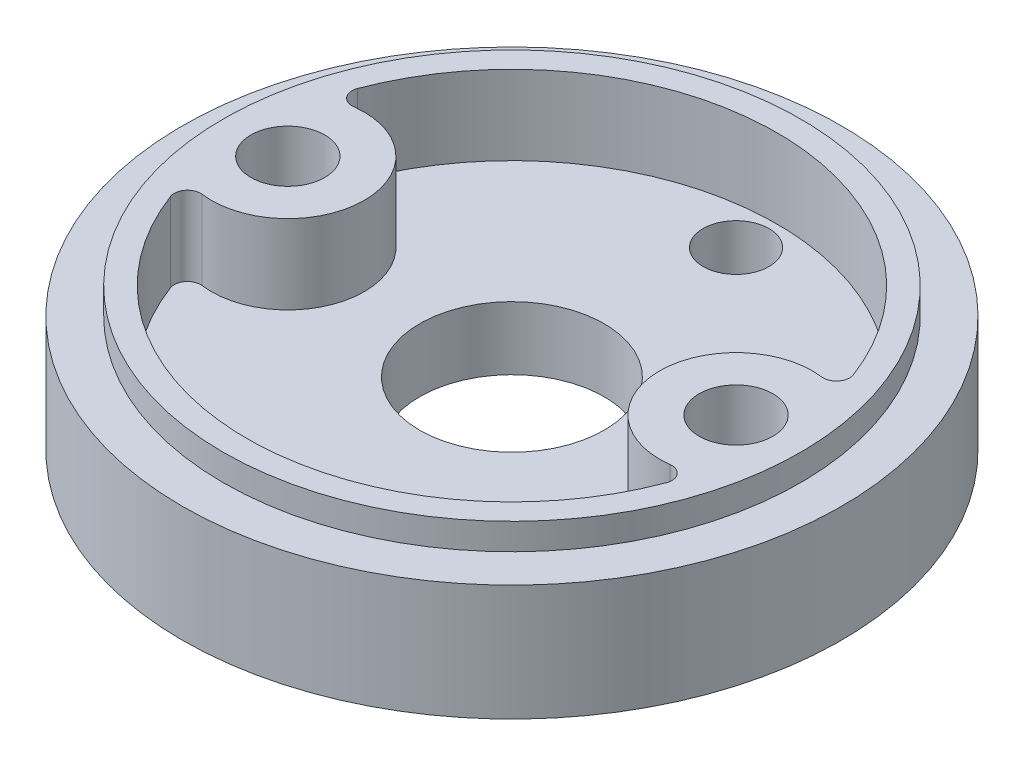
ISO-10303-21;
HEADER;
FILE_DESCRIPTION(('STEP AP214'),'2;1');
FILE_NAME('part.step','',(''),(''),'','','');
FILE_SCHEMA(('AUTOMOTIVE_DESIGN { 1 0 10303 214 1 1 1 1 }'));
ENDSEC;
DATA;
#1=APPLICATION_CONTEXT('core data for automotive mechanical design processes');
#2=APPLICATION_PROTOCOL_DEFINITION('international standard','automotive_design',2000,#1);
#3=PRODUCT_CONTEXT('',#1,'mechanical');
#4=PRODUCT('Part','Part','',(#3));
#5=PRODUCT_RELATED_PRODUCT_CATEGORY('part','',(#4));
#6=PRODUCT_DEFINITION_FORMATION('','',#4);
#7=PRODUCT_DEFINITION_CONTEXT('part definition',#1,'design');
#8=PRODUCT_DEFINITION('design','',#6,#7);
#9=PRODUCT_DEFINITION_SHAPE('','',#8);
#10=(LENGTH_UNIT() NAMED_UNIT(*) SI_UNIT(.MILLI.,.METRE.));
#11=(NAMED_UNIT(*) PLANE_ANGLE_UNIT() SI_UNIT($,.RADIAN.));
#12=(NAMED_UNIT(*) SI_UNIT($,.STERADIAN.) SOLID_ANGLE_UNIT());
#13=UNCERTAINTY_MEASURE_WITH_UNIT(LENGTH_MEASURE(1.E-05),#10,'distance_accuracy_value','');
#14=(GEOMETRIC_REPRESENTATION_CONTEXT(3) GLOBAL_UNCERTAINTY_ASSIGNED_CONTEXT((#13)) GLOBAL_UNIT_ASSIGNED_CONTEXT((#10,
#11,#12)) REPRESENTATION_CONTEXT('',''));
#15=CARTESIAN_POINT('',(0.,0.,0.));
#16=DIRECTION('',(0.,0.,1.));
#17=DIRECTION('',(1.,0.,0.));
#18=AXIS2_PLACEMENT_3D('',#15,#16,#17);
#19=CARTESIAN_POINT('',(8.5,5.4,0.));
#20=DIRECTION('',(0.,-1.,0.));
#21=DIRECTION('',(0.,0.,-1.));
#22=AXIS2_PLACEMENT_3D('',#19,#20,#21);
#23=CYLINDRICAL_SURFACE('',#22,1.4);
#24=CARTESIAN_POINT('',(8.5,5.4,0.));
#25=DIRECTION('',(0.,1.,0.));
#26=DIRECTION('',(0.,0.,1.));
#27=AXIS2_PLACEMENT_3D('',#24,#25,#26);
#28=CIRCLE('',#27,1.4);
#29=CARTESIAN_POINT('',(8.5,5.4,-1.4));
#30=VERTEX_POINT('',#29);
#31=EDGE_CURVE('E162',#30,#30,#28,.T.);
#32=CARTESIAN_POINT('',(8.5,2.65,0.));
#33=DIRECTION('',(0.,-1.,0.));
#34=DIRECTION('',(0.,0.,-1.));
#35=AXIS2_PLACEMENT_3D('',#32,#33,#34);
#36=CIRCLE('',#35,1.4);
#37=CARTESIAN_POINT('',(8.5,2.65,-1.4));
#38=VERTEX_POINT('',#37);
#39=EDGE_CURVE('E40',#38,#38,#36,.F.);
#40=CARTESIAN_POINT('',(8.5,5.4,-1.4));
#41=CARTESIAN_POINT('',(8.5,5.37135416666667,-1.4));
#42=CARTESIAN_POINT('',(8.5,5.34270833333333,-1.4));
#43=CARTESIAN_POINT('',(8.5,5.28541666666667,-1.4));
#44=CARTESIAN_POINT('',(8.5,5.25677083333333,-1.4));
#45=CARTESIAN_POINT('',(8.5,5.19947916666667,-1.4));
#46=CARTESIAN_POINT('',(8.5,5.17083333333333,-1.4));
#47=CARTESIAN_POINT('',(8.5,5.11354166666667,-1.4));
#48=CARTESIAN_POINT('',(8.5,5.08489583333333,-1.4));
#49=CARTESIAN_POINT('',(8.5,5.02760416666667,-1.4));
#50=CARTESIAN_POINT('',(8.5,4.99895833333333,-1.4));
#51=CARTESIAN_POINT('',(8.5,4.94166666666667,-1.4));
#52=CARTESIAN_POINT('',(8.5,4.91302083333333,-1.4));
#53=CARTESIAN_POINT('',(8.5,4.85572916666667,-1.4));
#54=CARTESIAN_POINT('',(8.5,4.82708333333333,-1.4));
#55=CARTESIAN_POINT('',(8.5,4.76979166666667,-1.4));
#56=CARTESIAN_POINT('',(8.5,4.74114583333333,-1.4));
#57=CARTESIAN_POINT('',(8.5,4.68385416666667,-1.4));
#58=CARTESIAN_POINT('',(8.5,4.65520833333333,-1.4));
#59=CARTESIAN_POINT('',(8.5,4.59791666666667,-1.4));
#60=CARTESIAN_POINT('',(8.5,4.56927083333333,-1.4));
#61=CARTESIAN_POINT('',(8.5,4.51197916666667,-1.4));
#62=CARTESIAN_POINT('',(8.5,4.48333333333333,-1.4));
#63=CARTESIAN_POINT('',(8.5,4.42604166666667,-1.4));
#64=CARTESIAN_POINT('',(8.5,4.39739583333333,-1.4));
#65=CARTESIAN_POINT('',(8.5,4.34010416666667,-1.4));
#66=CARTESIAN_POINT('',(8.5,4.31145833333333,-1.4));
#67=CARTESIAN_POINT('',(8.5,4.25416666666667,-1.4));
#68=CARTESIAN_POINT('',(8.5,4.22552083333333,-1.4));
#69=CARTESIAN_POINT('',(8.5,4.16822916666667,-1.4));
#70=CARTESIAN_POINT('',(8.5,4.13958333333333,-1.4));
#71=CARTESIAN_POINT('',(8.5,4.08229166666667,-1.4));
#72=CARTESIAN_POINT('',(8.5,4.05364583333333,-1.4));
#73=CARTESIAN_POINT('',(8.5,3.99635416666667,-1.4));
#74=CARTESIAN_POINT('',(8.5,3.96770833333333,-1.4));
#75=CARTESIAN_POINT('',(8.5,3.91041666666667,-1.4));
#76=CARTESIAN_POINT('',(8.5,3.88177083333333,-1.4));
#77=CARTESIAN_POINT('',(8.5,3.82447916666667,-1.4));
#78=CARTESIAN_POINT('',(8.5,3.79583333333333,-1.4));
#79=CARTESIAN_POINT('',(8.5,3.73854166666667,-1.4));
#80=CARTESIAN_POINT('',(8.5,3.70989583333333,-1.4));
#81=CARTESIAN_POINT('',(8.5,3.65260416666667,-1.4));
#82=CARTESIAN_POINT('',(8.5,3.62395833333333,-1.4));
#83=CARTESIAN_POINT('',(8.5,3.56666666666667,-1.4));
#84=CARTESIAN_POINT('',(8.5,3.53802083333333,-1.4));
#85=CARTESIAN_POINT('',(8.5,3.48072916666667,-1.4));
#86=CARTESIAN_POINT('',(8.5,3.45208333333333,-1.4));
#87=CARTESIAN_POINT('',(8.5,3.39479166666667,-1.4));
#88=CARTESIAN_POINT('',(8.5,3.36614583333333,-1.4));
#89=CARTESIAN_POINT('',(8.5,3.30885416666667,-1.4));
#90=CARTESIAN_POINT('',(8.5,3.28020833333333,-1.4));
#91=CARTESIAN_POINT('',(8.5,3.22291666666667,-1.4));
#92=CARTESIAN_POINT('',(8.5,3.19427083333333,-1.4));
#93=CARTESIAN_POINT('',(8.5,3.13697916666667,-1.4));
#94=CARTESIAN_POINT('',(8.5,3.10833333333333,-1.4));
#95=CARTESIAN_POINT('',(8.5,3.05104166666667,-1.4));
#96=CARTESIAN_POINT('',(8.5,3.02239583333333,-1.4));
#97=CARTESIAN_POINT('',(8.5,2.96510416666667,-1.4));
#98=CARTESIAN_POINT('',(8.5,2.93645833333333,-1.4));
#99=CARTESIAN_POINT('',(8.5,2.87916666666667,-1.4));
#100=CARTESIAN_POINT('',(8.5,2.85052083333333,-1.4));
#101=CARTESIAN_POINT('',(8.5,2.79322916666667,-1.4));
#102=CARTESIAN_POINT('',(8.5,2.76458333333333,-1.4));
#103=CARTESIAN_POINT('',(8.5,2.70729166666667,-1.4));
#104=CARTESIAN_POINT('',(8.5,2.67864583333333,-1.4));
#105=CARTESIAN_POINT('',(8.5,2.65,-1.4));
#106=B_SPLINE_CURVE_WITH_KNOTS('',3,(#40,#41,#42,#43,#44,#45,#46,#47,#48,#49,#50,#51,#52,#53,
#54,#55,#56,#57,#58,#59,#60,#61,#62,#63,#64,#65,#66,#67,#68,#69,#70,#71,#72,#73,#74,#75,#76,#77,
#78,#79,#80,#81,#82,#83,#84,#85,#86,#87,#88,#89,#90,#91,#92,#93,#94,#95,#96,#97,#98,#99,#100,
#101,#102,#103,#104,#105),.UNSPECIFIED.,.F.,.F.,(4,2,2,2,2,2,2,2,2,2,2,2,2,2,2,2,2,2,2,2,2,2,2,
2,2,2,2,2,2,2,2,2,4),(0.,0.0859374999999992,0.171874999999999,0.257812499999999,
0.343749999999999,0.4296875,0.515625,0.6015625,0.6875,0.7734375,0.859375,0.945312499999999,
1.03125,1.1171875,1.203125,1.2890625,1.375,1.4609375,1.546875,1.6328125,1.71875,1.8046875,
1.890625,1.9765625,2.0625,2.1484375,2.234375,2.3203125,2.40625,2.4921875,2.578125,2.6640625,
2.75),.UNSPECIFIED.);
#107=EDGE_CURVE('BSEAM36',#30,#38,#106,.T.);
#108=ORIENTED_EDGE('',*,*,#31,.T.);
#109=ORIENTED_EDGE('',*,*,#39,.F.);
#110=ORIENTED_EDGE('',*,*,#107,.T.);
#111=ORIENTED_EDGE('',*,*,#107,.F.);
#112=EDGE_LOOP('',(#108,#110,#109,#111));
#113=FACE_BOUND('',#112,.T.);
#114=ADVANCED_FACE('F36',(#113),#23,.F.);
#115=CARTESIAN_POINT('',(-8.5,5.4,0.));
#116=DIRECTION('',(0.,-1.,0.));
#117=DIRECTION('',(0.,0.,-1.));
#118=AXIS2_PLACEMENT_3D('',#115,#116,#117);
#119=CYLINDRICAL_SURFACE('',#118,1.4);
#120=CARTESIAN_POINT('',(-8.5,5.4,0.));
#121=DIRECTION('',(0.,1.,0.));
#122=DIRECTION('',(0.,0.,1.));
#123=AXIS2_PLACEMENT_3D('',#120,#121,#122);
#124=CIRCLE('',#123,1.4);
#125=CARTESIAN_POINT('',(-8.5,5.4,-1.4));
#126=VERTEX_POINT('',#125);
#127=EDGE_CURVE('E186',#126,#126,#124,.T.);
#128=CARTESIAN_POINT('',(-8.5,2.65,0.));
#129=DIRECTION('',(0.,-1.,0.));
#130=DIRECTION('',(0.,0.,-1.));
#131=AXIS2_PLACEMENT_3D('',#128,#129,#130);
#132=CIRCLE('',#131,1.4);
#133=CARTESIAN_POINT('',(-8.5,2.65,-1.4));
#134=VERTEX_POINT('',#133);
#135=EDGE_CURVE('E156',#134,#134,#132,.F.);
#136=CARTESIAN_POINT('',(-8.5,5.4,-1.4));
#137=CARTESIAN_POINT('',(-8.5,5.37135416666667,-1.4));
#138=CARTESIAN_POINT('',(-8.5,5.34270833333333,-1.4));
#139=CARTESIAN_POINT('',(-8.5,5.28541666666667,-1.4));
#140=CARTESIAN_POINT('',(-8.5,5.25677083333333,-1.4));
#141=CARTESIAN_POINT('',(-8.5,5.19947916666667,-1.4));
#142=CARTESIAN_POINT('',(-8.5,5.17083333333333,-1.4));
#143=CARTESIAN_POINT('',(-8.5,5.11354166666667,-1.4));
#144=CARTESIAN_POINT('',(-8.5,5.08489583333333,-1.4));
#145=CARTESIAN_POINT('',(-8.5,5.02760416666667,-1.4));
#146=CARTESIAN_POINT('',(-8.5,4.99895833333333,-1.4));
#147=CARTESIAN_POINT('',(-8.5,4.94166666666667,-1.4));
#148=CARTESIAN_POINT('',(-8.5,4.91302083333333,-1.4));
#149=CARTESIAN_POINT('',(-8.5,4.85572916666667,-1.4));
#150=CARTESIAN_POINT('',(-8.5,4.82708333333333,-1.4));
#151=CARTESIAN_POINT('',(-8.5,4.76979166666667,-1.4));
#152=CARTESIAN_POINT('',(-8.5,4.74114583333333,-1.4));
#153=CARTESIAN_POINT('',(-8.5,4.68385416666667,-1.4));
#154=CARTESIAN_POINT('',(-8.5,4.65520833333333,-1.4));
#155=CARTESIAN_POINT('',(-8.5,4.59791666666667,-1.4));
#156=CARTESIAN_POINT('',(-8.5,4.56927083333333,-1.4));
#157=CARTESIAN_POINT('',(-8.5,4.51197916666667,-1.4));
#158=CARTESIAN_POINT('',(-8.5,4.48333333333333,-1.4));
#159=CARTESIAN_POINT('',(-8.5,4.42604166666667,-1.4));
#160=CARTESIAN_POINT('',(-8.5,4.39739583333333,-1.4));
#161=CARTESIAN_POINT('',(-8.5,4.34010416666667,-1.4));
#162=CARTESIAN_POINT('',(-8.5,4.31145833333333,-1.4));
#163=CARTESIAN_POINT('',(-8.5,4.25416666666667,-1.4));
#164=CARTESIAN_POINT('',(-8.5,4.22552083333333,-1.4));
#165=CARTESIAN_POINT('',(-8.5,4.16822916666667,-1.4));
#166=CARTESIAN_POINT('',(-8.5,4.13958333333333,-1.4));
#167=CARTESIAN_POINT('',(-8.5,4.08229166666667,-1.4));
#168=CARTESIAN_POINT('',(-8.5,4.05364583333333,-1.4));
#169=CARTESIAN_POINT('',(-8.5,3.99635416666667,-1.4));
#170=CARTESIAN_POINT('',(-8.5,3.96770833333333,-1.4));
#171=CARTESIAN_POINT('',(-8.5,3.91041666666667,-1.4));
#172=CARTESIAN_POINT('',(-8.5,3.88177083333333,-1.4));
#173=CARTESIAN_POINT('',(-8.5,3.82447916666667,-1.4));
#174=CARTESIAN_POINT('',(-8.5,3.79583333333333,-1.4));
#175=CARTESIAN_POINT('',(-8.5,3.73854166666667,-1.4));
#176=CARTESIAN_POINT('',(-8.5,3.70989583333333,-1.4));
#177=CARTESIAN_POINT('',(-8.5,3.65260416666667,-1.4));
#178=CARTESIAN_POINT('',(-8.5,3.62395833333333,-1.4));
#179=CARTESIAN_POINT('',(-8.5,3.56666666666667,-1.4));
#180=CARTESIAN_POINT('',(-8.5,3.53802083333333,-1.4));
#181=CARTESIAN_POINT('',(-8.5,3.48072916666667,-1.4));
#182=CARTESIAN_POINT('',(-8.5,3.45208333333333,-1.4));
#183=CARTESIAN_POINT('',(-8.5,3.39479166666667,-1.4));
#184=CARTESIAN_POINT('',(-8.5,3.36614583333333,-1.4));
#185=CARTESIAN_POINT('',(-8.5,3.30885416666667,-1.4));
#186=CARTESIAN_POINT('',(-8.5,3.28020833333333,-1.4));
#187=CARTESIAN_POINT('',(-8.5,3.22291666666667,-1.4));
#188=CARTESIAN_POINT('',(-8.5,3.19427083333333,-1.4));
#189=CARTESIAN_POINT('',(-8.5,3.13697916666667,-1.4));
#190=CARTESIAN_POINT('',(-8.5,3.10833333333333,-1.4));
#191=CARTESIAN_POINT('',(-8.5,3.05104166666667,-1.4));
#192=CARTESIAN_POINT('',(-8.5,3.02239583333333,-1.4));
#193=CARTESIAN_POINT('',(-8.5,2.96510416666667,-1.4));
#194=CARTESIAN_POINT('',(-8.5,2.93645833333333,-1.4));
#195=CARTESIAN_POINT('',(-8.5,2.87916666666667,-1.4));
#196=CARTESIAN_POINT('',(-8.5,2.85052083333333,-1.4));
#197=CARTESIAN_POINT('',(-8.5,2.79322916666667,-1.4));
#198=CARTESIAN_POINT('',(-8.5,2.76458333333333,-1.4));
#199=CARTESIAN_POINT('',(-8.5,2.70729166666667,-1.4));
#200=CARTESIAN_POINT('',(-8.5,2.67864583333333,-1.4));
#201=CARTESIAN_POINT('',(-8.5,2.65,-1.4));
#202=B_SPLINE_CURVE_WITH_KNOTS('',3,(#136,#137,#138,#139,#140,#141,#142,#143,#144,#145,#146,
#147,#148,#149,#150,#151,#152,#153,#154,#155,#156,#157,#158,#159,#160,#161,#162,#163,#164,#165,
#166,#167,#168,#169,#170,#171,#172,#173,#174,#175,#176,#177,#178,#179,#180,#181,#182,#183,#184,
#185,#186,#187,#188,#189,#190,#191,#192,#193,#194,#195,#196,#197,#198,#199,#200,#201),
.UNSPECIFIED.,.F.,.F.,(4,2,2,2,2,2,2,2,2,2,2,2,2,2,2,2,2,2,2,2,2,2,2,2,2,2,2,2,2,2,2,2,4),(0.,
0.0859374999999992,0.171874999999999,0.257812499999999,0.343749999999999,0.4296875,0.515625,
0.6015625,0.6875,0.7734375,0.859375,0.945312499999999,1.03125,1.1171875,1.203125,1.2890625,
1.375,1.4609375,1.546875,1.6328125,1.71875,1.8046875,1.890625,1.9765625,2.0625,2.1484375,
2.234375,2.3203125,2.40625,2.4921875,2.578125,2.6640625,2.75),.UNSPECIFIED.);
#203=EDGE_CURVE('BSEAM233',#126,#134,#202,.T.);
#204=ORIENTED_EDGE('',*,*,#127,.T.);
#205=ORIENTED_EDGE('',*,*,#135,.F.);
#206=ORIENTED_EDGE('',*,*,#203,.T.);
#207=ORIENTED_EDGE('',*,*,#203,.F.);
#208=EDGE_LOOP('',(#204,#206,#205,#207));
#209=FACE_BOUND('',#208,.T.);
#210=ADVANCED_FACE('F233',(#209),#119,.F.);
#211=CARTESIAN_POINT('',(0.,2.4,0.));
#212=DIRECTION('',(0.,1.,0.));
#213=DIRECTION('',(0.,0.,1.));
#214=AXIS2_PLACEMENT_3D('',#211,#212,#213);
#215=CYLINDRICAL_SURFACE('',#214,10.05);
#216=CARTESIAN_POINT('',(0.,2.4,0.));
#217=DIRECTION('',(0.,1.,0.));
#218=DIRECTION('',(0.,0.,1.));
#219=AXIS2_PLACEMENT_3D('',#216,#217,#218);
#220=CIRCLE('',#219,10.05);
#221=CARTESIAN_POINT('',(9.40264628888205,2.4,-3.54862547561344));
#222=VERTEX_POINT('',#221);
#223=CARTESIAN_POINT('',(-9.40264628888205,2.4,-3.54862547561344));
#224=VERTEX_POINT('',#223);
#225=EDGE_CURVE('E122',#222,#224,#220,.T.);
#226=ORIENTED_EDGE('',*,*,#225,.F.);
#227=DIRECTION('',(0.,1.,0.));
#228=VECTOR('',#227,1.);
#229=CARTESIAN_POINT('',(9.40264628888205,2.4,-3.54862547561344));
#230=LINE('',#229,#228);
#231=CARTESIAN_POINT('',(9.40264628888205,5.4,-3.54862547561344));
#232=VERTEX_POINT('',#231);
#233=EDGE_CURVE('E147',#222,#232,#230,.T.);
#234=ORIENTED_EDGE('',*,*,#233,.T.);
#235=CARTESIAN_POINT('',(0.,5.4,0.));
#236=DIRECTION('',(0.,1.,0.));
#237=DIRECTION('',(0.,0.,1.));
#238=AXIS2_PLACEMENT_3D('',#235,#236,#237);
#239=CIRCLE('',#238,10.05);
#240=CARTESIAN_POINT('',(-9.40264628888205,5.4,-3.54862547561344));
#241=VERTEX_POINT('',#240);
#242=EDGE_CURVE('E198',#232,#241,#239,.T.);
#243=ORIENTED_EDGE('',*,*,#242,.T.);
#244=DIRECTION('',(0.,1.,0.));
#245=VECTOR('',#244,1.);
#246=CARTESIAN_POINT('',(-9.40264628888205,2.4,-3.54862547561344));
#247=LINE('',#246,#245);
#248=EDGE_CURVE('E144',#241,#224,#247,.F.);
#249=ORIENTED_EDGE('',*,*,#248,.T.);
#250=EDGE_LOOP('',(#226,#234,#243,#249));
#251=FACE_BOUND('',#250,.T.);
#252=ADVANCED_FACE('F239',(#251),#215,.F.);
#253=CARTESIAN_POINT('',(-9.40264628888205,5.4,3.54862547561344));
#254=VERTEX_POINT('',#253);
#255=CARTESIAN_POINT('',(9.40264628888205,5.4,3.54862547561344));
#256=VERTEX_POINT('',#255);
#257=EDGE_CURVE('E202',#254,#256,#239,.T.);
#258=ORIENTED_EDGE('',*,*,#257,.T.);
#259=DIRECTION('',(0.,1.,0.));
#260=VECTOR('',#259,1.);
#261=CARTESIAN_POINT('',(9.40264628888205,2.4,3.54862547561344));
#262=LINE('',#261,#260);
#263=CARTESIAN_POINT('',(9.40264628888205,2.4,3.54862547561344));
#264=VERTEX_POINT('',#263);
#265=EDGE_CURVE('E113',#256,#264,#262,.F.);
#266=ORIENTED_EDGE('',*,*,#265,.T.);
#267=CARTESIAN_POINT('',(-9.40264628888205,2.4,3.54862547561344));
#268=VERTEX_POINT('',#267);
#269=EDGE_CURVE('E106',#268,#264,#220,.T.);
#270=ORIENTED_EDGE('',*,*,#269,.F.);
#271=DIRECTION('',(0.,1.,0.));
#272=VECTOR('',#271,1.);
#273=CARTESIAN_POINT('',(-9.40264628888205,2.4,3.54862547561344));
#274=LINE('',#273,#272);
#275=EDGE_CURVE('E119',#268,#254,#274,.T.);
#276=ORIENTED_EDGE('',*,*,#275,.T.);
#277=EDGE_LOOP('',(#258,#266,#270,#276));
#278=FACE_BOUND('',#277,.T.);
#279=ADVANCED_FACE('F118',(#278),#215,.F.);
#280=CARTESIAN_POINT('',(0.,2.4,0.));
#281=DIRECTION('',(0.,1.,0.));
#282=DIRECTION('',(0.,0.,1.));
#283=AXIS2_PLACEMENT_3D('',#280,#281,#282);
#284=PLANE('',#283);
#285=CARTESIAN_POINT('',(0.,2.4,-8.5));
#286=DIRECTION('',(0.,1.,0.));
#287=DIRECTION('',(0.,0.,1.));
#288=AXIS2_PLACEMENT_3D('',#285,#286,#287);
#289=CIRCLE('',#288,1.25);
#290=CARTESIAN_POINT('',(0.,2.4,-7.25));
#291=VERTEX_POINT('',#290);
#292=EDGE_CURVE('E320',#291,#291,#289,.T.);
#293=ORIENTED_EDGE('',*,*,#292,.F.);
#294=EDGE_LOOP('',(#293));
#295=FACE_BOUND('',#294,.T.);
#296=CARTESIAN_POINT('',(0.,2.4,8.5));
#297=DIRECTION('',(0.,1.,0.));
#298=DIRECTION('',(0.,0.,1.));
#299=AXIS2_PLACEMENT_3D('',#296,#297,#298);
#300=CIRCLE('',#299,1.25);
#301=CARTESIAN_POINT('',(0.,2.4,9.75));
#302=VERTEX_POINT('',#301);
#303=EDGE_CURVE('E172',#302,#302,#300,.T.);
#304=ORIENTED_EDGE('',*,*,#303,.F.);
#305=EDGE_LOOP('',(#304));
#306=FACE_BOUND('',#305,.T.);
#307=CARTESIAN_POINT('',(0.,2.4,0.));
#308=DIRECTION('',(0.,1.,0.));
#309=DIRECTION('',(0.,0.,1.));
#310=AXIS2_PLACEMENT_3D('',#307,#308,#309);
#311=CIRCLE('',#310,3.5);
#312=CARTESIAN_POINT('',(0.,2.4,3.5));
#313=VERTEX_POINT('',#312);
#314=EDGE_CURVE('E192',#313,#313,#311,.T.);
#315=ORIENTED_EDGE('',*,*,#314,.F.);
#316=EDGE_LOOP('',(#315));
#317=FACE_BOUND('',#316,.T.);
#318=ORIENTED_EDGE('',*,*,#269,.T.);
#319=CARTESIAN_POINT('',(8.93485294117647,2.4,3.37207694448839));
#320=DIRECTION('',(0.,1.,0.));
#321=DIRECTION('',(0.,0.,1.));
#322=AXIS2_PLACEMENT_3D('',#319,#320,#321);
#323=CIRCLE('',#322,0.5);
#324=CARTESIAN_POINT('',(8.87090397923875,2.4,2.87618327618128));
#325=VERTEX_POINT('',#324);
#326=EDGE_CURVE('E137',#264,#325,#323,.T.);
#327=ORIENTED_EDGE('',*,*,#326,.T.);
#328=CARTESIAN_POINT('',(8.5,2.4,0.));
#329=DIRECTION('',(0.,1.,0.));
#330=DIRECTION('',(0.,0.,-1.));
#331=AXIS2_PLACEMENT_3D('',#328,#329,#330);
#332=CIRCLE('',#331,2.9);
#333=CARTESIAN_POINT('',(8.87090397923875,2.4,-2.87618327618128));
#334=VERTEX_POINT('',#333);
#335=EDGE_CURVE('E183',#334,#325,#332,.T.);
#336=ORIENTED_EDGE('',*,*,#335,.F.);
#337=CARTESIAN_POINT('',(8.93485294117647,2.4,-3.37207694448839));
#338=DIRECTION('',(0.,1.,0.));
#339=DIRECTION('',(0.,0.,1.));
#340=AXIS2_PLACEMENT_3D('',#337,#338,#339);
#341=CIRCLE('',#340,0.5);
#342=EDGE_CURVE('E135',#334,#222,#341,.T.);
#343=ORIENTED_EDGE('',*,*,#342,.T.);
#344=ORIENTED_EDGE('',*,*,#225,.T.);
#345=CARTESIAN_POINT('',(-8.93485294117647,2.4,-3.37207694448839));
#346=DIRECTION('',(0.,1.,0.));
#347=DIRECTION('',(0.,0.,1.));
#348=AXIS2_PLACEMENT_3D('',#345,#346,#347);
#349=CIRCLE('',#348,0.5);
#350=CARTESIAN_POINT('',(-8.87090397923875,2.4,-2.87618327618128));
#351=VERTEX_POINT('',#350);
#352=EDGE_CURVE('E112',#224,#351,#349,.T.);
#353=ORIENTED_EDGE('',*,*,#352,.T.);
#354=CARTESIAN_POINT('',(-8.5,2.4,0.));
#355=DIRECTION('',(0.,1.,0.));
#356=DIRECTION('',(0.,0.,-1.));
#357=AXIS2_PLACEMENT_3D('',#354,#355,#356);
#358=CIRCLE('',#357,2.9);
#359=CARTESIAN_POINT('',(-8.87090397923875,2.4,2.87618327618128));
#360=VERTEX_POINT('',#359);
#361=EDGE_CURVE('E107',#360,#351,#358,.T.);
#362=ORIENTED_EDGE('',*,*,#361,.F.);
#363=CARTESIAN_POINT('',(-8.93485294117647,2.4,3.37207694448839));
#364=DIRECTION('',(0.,1.,0.));
#365=DIRECTION('',(0.,0.,1.));
#366=AXIS2_PLACEMENT_3D('',#363,#364,#365);
#367=CIRCLE('',#366,0.5);
#368=EDGE_CURVE('E103',#360,#268,#367,.T.);
#369=ORIENTED_EDGE('',*,*,#368,.T.);
#370=EDGE_LOOP('',(#318,#327,#336,#343,#344,#353,#362,#369));
#371=FACE_BOUND('',#370,.T.);
#372=ADVANCED_FACE('F105',(#295,#306,#317,#371),#284,.T.);
#373=CARTESIAN_POINT('',(0.,4.4,0.));
#374=DIRECTION('',(0.,-1.,0.));
#375=DIRECTION('',(0.,0.,-1.));
#376=AXIS2_PLACEMENT_3D('',#373,#374,#375);
#377=CYLINDRICAL_SURFACE('',#376,12.5);
#378=CARTESIAN_POINT('',(0.,4.4,0.));
#379=DIRECTION('',(0.,1.,0.));
#380=DIRECTION('',(0.,0.,1.));
#381=AXIS2_PLACEMENT_3D('',#378,#379,#380);
#382=CIRCLE('',#381,12.5);
#383=CARTESIAN_POINT('',(0.,4.4,12.5));
#384=VERTEX_POINT('',#383);
#385=EDGE_CURVE('E128',#384,#384,#382,.T.);
#386=ORIENTED_EDGE('',*,*,#385,.F.);
#387=EDGE_LOOP('',(#386));
#388=FACE_BOUND('',#387,.T.);
#389=CARTESIAN_POINT('',(0.,0.,0.));
#390=DIRECTION('',(0.,1.,0.));
#391=DIRECTION('',(0.,0.,1.));
#392=AXIS2_PLACEMENT_3D('',#389,#390,#391);
#393=CIRCLE('',#392,12.5);
#394=CARTESIAN_POINT('',(0.,0.,12.5));
#395=VERTEX_POINT('',#394);
#396=EDGE_CURVE('E131',#395,#395,#393,.T.);
#397=ORIENTED_EDGE('',*,*,#396,.T.);
#398=EDGE_LOOP('',(#397));
#399=FACE_BOUND('',#398,.T.);
#400=ADVANCED_FACE('F212',(#388,#399),#377,.T.);
#401=CARTESIAN_POINT('',(0.,4.4,0.));
#402=DIRECTION('',(0.,1.,0.));
#403=DIRECTION('',(0.,0.,1.));
#404=AXIS2_PLACEMENT_3D('',#401,#402,#403);
#405=PLANE('',#404);
#406=CARTESIAN_POINT('',(0.,4.4,0.));
#407=DIRECTION('',(0.,1.,0.));
#408=DIRECTION('',(0.,0.,1.));
#409=AXIS2_PLACEMENT_3D('',#406,#407,#408);
#410=CIRCLE('',#409,10.95);
#411=CARTESIAN_POINT('',(0.,4.4,10.95));
#412=VERTEX_POINT('',#411);
#413=EDGE_CURVE('E124',#412,#412,#410,.T.);
#414=ORIENTED_EDGE('',*,*,#413,.F.);
#415=EDGE_LOOP('',(#414));
#416=FACE_BOUND('',#415,.T.);
#417=ORIENTED_EDGE('',*,*,#385,.T.);
#418=EDGE_LOOP('',(#417));
#419=FACE_BOUND('',#418,.T.);
#420=ADVANCED_FACE('F217',(#416,#419),#405,.T.);
#421=CARTESIAN_POINT('',(0.,0.,0.));
#422=DIRECTION('',(0.,1.,0.));
#423=DIRECTION('',(0.,0.,1.));
#424=AXIS2_PLACEMENT_3D('',#421,#422,#423);
#425=PLANE('',#424);
#426=CARTESIAN_POINT('',(0.,0.,-8.5));
#427=DIRECTION('',(0.,-1.,0.));
#428=DIRECTION('',(0.,0.,-1.));
#429=AXIS2_PLACEMENT_3D('',#426,#427,#428);
#430=CIRCLE('',#429,1.25);
#431=CARTESIAN_POINT('',(0.,0.,-9.75));
#432=VERTEX_POINT('',#431);
#433=EDGE_CURVE('E322',#432,#432,#430,.T.);
#434=ORIENTED_EDGE('',*,*,#433,.F.);
#435=EDGE_LOOP('',(#434));
#436=FACE_BOUND('',#435,.T.);
#437=CARTESIAN_POINT('',(0.,0.,8.5));
#438=DIRECTION('',(0.,-1.,0.));
#439=DIRECTION('',(0.,0.,-1.));
#440=AXIS2_PLACEMENT_3D('',#437,#438,#439);
#441=CIRCLE('',#440,1.25);
#442=CARTESIAN_POINT('',(0.,0.,7.25));
#443=VERTEX_POINT('',#442);
#444=EDGE_CURVE('E324',#443,#443,#441,.T.);
#445=ORIENTED_EDGE('',*,*,#444,.F.);
#446=EDGE_LOOP('',(#445));
#447=FACE_BOUND('',#446,.T.);
#448=CARTESIAN_POINT('',(-8.5,0.,0.));
#449=DIRECTION('',(0.,-1.,0.));
#450=DIRECTION('',(0.,0.,-1.));
#451=AXIS2_PLACEMENT_3D('',#448,#449,#450);
#452=CIRCLE('',#451,2.5);
#453=CARTESIAN_POINT('',(-8.5,0.,-2.5));
#454=VERTEX_POINT('',#453);
#455=EDGE_CURVE('E164',#454,#454,#452,.T.);
#456=ORIENTED_EDGE('',*,*,#455,.F.);
#457=EDGE_LOOP('',(#456));
#458=FACE_BOUND('',#457,.T.);
#459=CARTESIAN_POINT('',(8.5,0.,0.));
#460=DIRECTION('',(0.,-1.,0.));
#461=DIRECTION('',(0.,0.,-1.));
#462=AXIS2_PLACEMENT_3D('',#459,#460,#461);
#463=CIRCLE('',#462,2.5);
#464=CARTESIAN_POINT('',(8.5,0.,-2.5));
#465=VERTEX_POINT('',#464);
#466=EDGE_CURVE('E177',#465,#465,#463,.T.);
#467=ORIENTED_EDGE('',*,*,#466,.F.);
#468=EDGE_LOOP('',(#467));
#469=FACE_BOUND('',#468,.T.);
#470=CARTESIAN_POINT('',(0.,0.,0.));
#471=DIRECTION('',(0.,1.,0.));
#472=DIRECTION('',(0.,0.,1.));
#473=AXIS2_PLACEMENT_3D('',#470,#471,#472);
#474=CIRCLE('',#473,3.5);
#475=CARTESIAN_POINT('',(0.,0.,3.5));
#476=VERTEX_POINT('',#475);
#477=EDGE_CURVE('E195',#476,#476,#474,.T.);
#478=ORIENTED_EDGE('',*,*,#477,.T.);
#479=EDGE_LOOP('',(#478));
#480=FACE_BOUND('',#479,.T.);
#481=ORIENTED_EDGE('',*,*,#396,.F.);
#482=EDGE_LOOP('',(#481));
#483=FACE_BOUND('',#482,.T.);
#484=ADVANCED_FACE('F214',(#436,#447,#458,#469,#480,#483),#425,.F.);
#485=CARTESIAN_POINT('',(0.,5.4,0.));
#486=DIRECTION('',(0.,-1.,0.));
#487=DIRECTION('',(0.,0.,-1.));
#488=AXIS2_PLACEMENT_3D('',#485,#486,#487);
#489=CYLINDRICAL_SURFACE('',#488,10.95);
#490=CARTESIAN_POINT('',(0.,5.4,0.));
#491=DIRECTION('',(0.,1.,0.));
#492=DIRECTION('',(0.,0.,1.));
#493=AXIS2_PLACEMENT_3D('',#490,#491,#492);
#494=CIRCLE('',#493,10.95);
#495=CARTESIAN_POINT('',(0.,5.4,10.95));
#496=VERTEX_POINT('',#495);
#497=EDGE_CURVE('E121',#496,#496,#494,.T.);
#498=ORIENTED_EDGE('',*,*,#497,.F.);
#499=EDGE_LOOP('',(#498));
#500=FACE_BOUND('',#499,.T.);
#501=ORIENTED_EDGE('',*,*,#413,.T.);
#502=EDGE_LOOP('',(#501));
#503=FACE_BOUND('',#502,.T.);
#504=ADVANCED_FACE('F216',(#500,#503),#489,.T.);
#505=CARTESIAN_POINT('',(0.,5.4,0.));
#506=DIRECTION('',(0.,1.,0.));
#507=DIRECTION('',(0.,0.,1.));
#508=AXIS2_PLACEMENT_3D('',#505,#506,#507);
#509=PLANE('',#508);
#510=ORIENTED_EDGE('',*,*,#257,.F.);
#511=CARTESIAN_POINT('',(-8.93485294117647,5.4,3.37207694448839));
#512=DIRECTION('',(0.,1.,0.));
#513=DIRECTION('',(0.,0.,1.));
#514=AXIS2_PLACEMENT_3D('',#511,#512,#513);
#515=CIRCLE('',#514,0.5);
#516=CARTESIAN_POINT('',(-8.87090397923875,5.4,2.87618327618128));
#517=VERTEX_POINT('',#516);
#518=EDGE_CURVE('E11',#254,#517,#515,.F.);
#519=ORIENTED_EDGE('',*,*,#518,.T.);
#520=CARTESIAN_POINT('',(-8.5,5.4,0.));
#521=DIRECTION('',(0.,1.,0.));
#522=DIRECTION('',(0.,0.,1.));
#523=AXIS2_PLACEMENT_3D('',#520,#521,#522);
#524=CIRCLE('',#523,2.9);
#525=CARTESIAN_POINT('',(-8.87090397923875,5.4,-2.87618327618128));
#526=VERTEX_POINT('',#525);
#527=EDGE_CURVE('E189',#517,#526,#524,.T.);
#528=ORIENTED_EDGE('',*,*,#527,.T.);
#529=CARTESIAN_POINT('',(-8.93485294117647,5.4,-3.37207694448839));
#530=DIRECTION('',(0.,1.,0.));
#531=DIRECTION('',(0.,0.,1.));
#532=AXIS2_PLACEMENT_3D('',#529,#530,#531);
#533=CIRCLE('',#532,0.5);
#534=EDGE_CURVE('E45',#526,#241,#533,.F.);
#535=ORIENTED_EDGE('',*,*,#534,.T.);
#536=ORIENTED_EDGE('',*,*,#242,.F.);
#537=CARTESIAN_POINT('',(8.93485294117647,5.4,-3.37207694448839));
#538=DIRECTION('',(0.,1.,0.));
#539=DIRECTION('',(0.,0.,1.));
#540=AXIS2_PLACEMENT_3D('',#537,#538,#539);
#541=CIRCLE('',#540,0.5);
#542=CARTESIAN_POINT('',(8.87090397923875,5.4,-2.87618327618128));
#543=VERTEX_POINT('',#542);
#544=EDGE_CURVE('E154',#232,#543,#541,.F.);
#545=ORIENTED_EDGE('',*,*,#544,.T.);
#546=CARTESIAN_POINT('',(8.5,5.4,0.));
#547=DIRECTION('',(0.,1.,0.));
#548=DIRECTION('',(0.,0.,1.));
#549=AXIS2_PLACEMENT_3D('',#546,#547,#548);
#550=CIRCLE('',#549,2.9);
#551=CARTESIAN_POINT('',(8.87090397923875,5.4,2.87618327618128));
#552=VERTEX_POINT('',#551);
#553=EDGE_CURVE('E180',#543,#552,#550,.T.);
#554=ORIENTED_EDGE('',*,*,#553,.T.);
#555=CARTESIAN_POINT('',(8.93485294117647,5.4,3.37207694448839));
#556=DIRECTION('',(0.,1.,0.));
#557=DIRECTION('',(0.,0.,1.));
#558=AXIS2_PLACEMENT_3D('',#555,#556,#557);
#559=CIRCLE('',#558,0.5);
#560=EDGE_CURVE('E152',#552,#256,#559,.F.);
#561=ORIENTED_EDGE('',*,*,#560,.T.);
#562=EDGE_LOOP('',(#510,#519,#528,#535,#536,#545,#554,#561));
#563=FACE_BOUND('',#562,.T.);
#564=ORIENTED_EDGE('',*,*,#497,.T.);
#565=EDGE_LOOP('',(#564));
#566=FACE_BOUND('',#565,.T.);
#567=ORIENTED_EDGE('',*,*,#127,.F.);
#568=EDGE_LOOP('',(#567));
#569=FACE_BOUND('',#568,.T.);
#570=ORIENTED_EDGE('',*,*,#31,.F.);
#571=EDGE_LOOP('',(#570));
#572=FACE_BOUND('',#571,.T.);
#573=ADVANCED_FACE('F224',(#563,#566,#569,#572),#509,.T.);
#574=CARTESIAN_POINT('',(0.,0.,0.));
#575=DIRECTION('',(0.,1.,0.));
#576=DIRECTION('',(0.,0.,1.));
#577=AXIS2_PLACEMENT_3D('',#574,#575,#576);
#578=CYLINDRICAL_SURFACE('',#577,3.5);
#579=ORIENTED_EDGE('',*,*,#477,.F.);
#580=EDGE_LOOP('',(#579));
#581=FACE_BOUND('',#580,.T.);
#582=ORIENTED_EDGE('',*,*,#314,.T.);
#583=EDGE_LOOP('',(#582));
#584=FACE_BOUND('',#583,.T.);
#585=ADVANCED_FACE('F245',(#581,#584),#578,.F.);
#586=CARTESIAN_POINT('',(-8.5,12.7104377433913,0.));
#587=DIRECTION('',(0.,-1.,0.));
#588=DIRECTION('',(0.,0.,-1.));
#589=AXIS2_PLACEMENT_3D('',#586,#587,#588);
#590=CYLINDRICAL_SURFACE('',#589,2.9);
#591=ORIENTED_EDGE('',*,*,#361,.T.);
#592=DIRECTION('',(0.,-1.,0.));
#593=VECTOR('',#592,1.);
#594=CARTESIAN_POINT('',(-8.87090397923875,12.7104377433913,-2.87618327618127));
#595=LINE('',#594,#593);
#596=EDGE_CURVE('E53',#351,#526,#595,.F.);
#597=ORIENTED_EDGE('',*,*,#596,.T.);
#598=ORIENTED_EDGE('',*,*,#527,.F.);
#599=DIRECTION('',(0.,-1.,0.));
#600=VECTOR('',#599,1.);
#601=CARTESIAN_POINT('',(-8.87090397923875,12.7104377433913,2.87618327618128));
#602=LINE('',#601,#600);
#603=EDGE_CURVE('E149',#517,#360,#602,.T.);
#604=ORIENTED_EDGE('',*,*,#603,.T.);
#605=EDGE_LOOP('',(#591,#597,#598,#604));
#606=FACE_BOUND('',#605,.T.);
#607=ADVANCED_FACE('F248',(#606),#590,.T.);
#608=CARTESIAN_POINT('',(8.5,12.7104377433913,0.));
#609=DIRECTION('',(0.,-1.,0.));
#610=DIRECTION('',(0.,0.,-1.));
#611=AXIS2_PLACEMENT_3D('',#608,#609,#610);
#612=CYLINDRICAL_SURFACE('',#611,2.9);
#613=ORIENTED_EDGE('',*,*,#335,.T.);
#614=DIRECTION('',(0.,-1.,0.));
#615=VECTOR('',#614,1.);
#616=CARTESIAN_POINT('',(8.87090397923875,12.7104377433913,2.87618327618127));
#617=LINE('',#616,#615);
#618=EDGE_CURVE('E142',#325,#552,#617,.F.);
#619=ORIENTED_EDGE('',*,*,#618,.T.);
#620=ORIENTED_EDGE('',*,*,#553,.F.);
#621=DIRECTION('',(0.,-1.,0.));
#622=VECTOR('',#621,1.);
#623=CARTESIAN_POINT('',(8.87090397923875,12.7104377433913,-2.87618327618128));
#624=LINE('',#623,#622);
#625=EDGE_CURVE('E139',#543,#334,#624,.T.);
#626=ORIENTED_EDGE('',*,*,#625,.T.);
#627=EDGE_LOOP('',(#613,#619,#620,#626));
#628=FACE_BOUND('',#627,.T.);
#629=ADVANCED_FACE('F274',(#628),#612,.T.);
#630=CARTESIAN_POINT('',(8.93485294117647,12.7104377433913,3.37207694448839));
#631=DIRECTION('',(0.,-1.,0.));
#632=DIRECTION('',(0.,0.,-1.));
#633=AXIS2_PLACEMENT_3D('',#630,#631,#632);
#634=CYLINDRICAL_SURFACE('',#633,0.5);
#635=ORIENTED_EDGE('',*,*,#560,.F.);
#636=ORIENTED_EDGE('',*,*,#618,.F.);
#637=ORIENTED_EDGE('',*,*,#326,.F.);
#638=ORIENTED_EDGE('',*,*,#265,.F.);
#639=EDGE_LOOP('',(#635,#636,#637,#638));
#640=FACE_BOUND('',#639,.T.);
#641=ADVANCED_FACE('F270',(#640),#634,.F.);
#642=CARTESIAN_POINT('',(8.93485294117647,2.4,-3.37207694448839));
#643=DIRECTION('',(0.,-1.,0.));
#644=DIRECTION('',(0.,0.,-1.));
#645=AXIS2_PLACEMENT_3D('',#642,#643,#644);
#646=CYLINDRICAL_SURFACE('',#645,0.5);
#647=ORIENTED_EDGE('',*,*,#544,.F.);
#648=ORIENTED_EDGE('',*,*,#233,.F.);
#649=ORIENTED_EDGE('',*,*,#342,.F.);
#650=ORIENTED_EDGE('',*,*,#625,.F.);
#651=EDGE_LOOP('',(#647,#648,#649,#650));
#652=FACE_BOUND('',#651,.T.);
#653=ADVANCED_FACE('F279',(#652),#646,.F.);
#654=CARTESIAN_POINT('',(-8.93485294117647,12.7104377433913,-3.37207694448839));
#655=DIRECTION('',(0.,-1.,0.));
#656=DIRECTION('',(0.,0.,-1.));
#657=AXIS2_PLACEMENT_3D('',#654,#655,#656);
#658=CYLINDRICAL_SURFACE('',#657,0.5);
#659=ORIENTED_EDGE('',*,*,#534,.F.);
#660=ORIENTED_EDGE('',*,*,#596,.F.);
#661=ORIENTED_EDGE('',*,*,#352,.F.);
#662=ORIENTED_EDGE('',*,*,#248,.F.);
#663=EDGE_LOOP('',(#659,#660,#661,#662));
#664=FACE_BOUND('',#663,.T.);
#665=ADVANCED_FACE('F286',(#664),#658,.F.);
#666=CARTESIAN_POINT('',(-8.93485294117647,2.4,3.37207694448839));
#667=DIRECTION('',(0.,-1.,0.));
#668=DIRECTION('',(0.,0.,-1.));
#669=AXIS2_PLACEMENT_3D('',#666,#667,#668);
#670=CYLINDRICAL_SURFACE('',#669,0.5);
#671=ORIENTED_EDGE('',*,*,#518,.F.);
#672=ORIENTED_EDGE('',*,*,#275,.F.);
#673=ORIENTED_EDGE('',*,*,#368,.F.);
#674=ORIENTED_EDGE('',*,*,#603,.F.);
#675=EDGE_LOOP('',(#671,#672,#673,#674));
#676=FACE_BOUND('',#675,.T.);
#677=ADVANCED_FACE('F38',(#676),#670,.F.);
#678=CARTESIAN_POINT('',(-8.5,2.65,0.));
#679=DIRECTION('',(0.,-1.,0.));
#680=DIRECTION('',(0.,0.,-1.));
#681=AXIS2_PLACEMENT_3D('',#678,#679,#680);
#682=PLANE('',#681);
#683=CARTESIAN_POINT('',(-8.5,2.65,0.));
#684=DIRECTION('',(0.,-1.,0.));
#685=DIRECTION('',(0.,0.,-1.));
#686=AXIS2_PLACEMENT_3D('',#683,#684,#685);
#687=CIRCLE('',#686,2.5);
#688=CARTESIAN_POINT('',(-8.5,2.65,-2.5));
#689=VERTEX_POINT('',#688);
#690=EDGE_CURVE('E158',#689,#689,#687,.T.);
#691=ORIENTED_EDGE('',*,*,#690,.T.);
#692=EDGE_LOOP('',(#691));
#693=FACE_BOUND('',#692,.T.);
#694=ORIENTED_EDGE('',*,*,#135,.T.);
#695=EDGE_LOOP('',(#694));
#696=FACE_BOUND('',#695,.T.);
#697=ADVANCED_FACE('F305',(#693,#696),#682,.T.);
#698=CARTESIAN_POINT('',(-8.5,2.65,0.));
#699=DIRECTION('',(0.,-1.,0.));
#700=DIRECTION('',(0.,0.,-1.));
#701=AXIS2_PLACEMENT_3D('',#698,#699,#700);
#702=CYLINDRICAL_SURFACE('',#701,2.5);
#703=ORIENTED_EDGE('',*,*,#690,.F.);
#704=EDGE_LOOP('',(#703));
#705=FACE_BOUND('',#704,.T.);
#706=ORIENTED_EDGE('',*,*,#455,.T.);
#707=EDGE_LOOP('',(#706));
#708=FACE_BOUND('',#707,.T.);
#709=ADVANCED_FACE('F301',(#705,#708),#702,.F.);
#710=CARTESIAN_POINT('',(8.5,2.65,0.));
#711=DIRECTION('',(0.,-1.,0.));
#712=DIRECTION('',(0.,0.,-1.));
#713=AXIS2_PLACEMENT_3D('',#710,#711,#712);
#714=PLANE('',#713);
#715=CARTESIAN_POINT('',(8.5,2.65,0.));
#716=DIRECTION('',(0.,-1.,0.));
#717=DIRECTION('',(0.,0.,-1.));
#718=AXIS2_PLACEMENT_3D('',#715,#716,#717);
#719=CIRCLE('',#718,2.5);
#720=CARTESIAN_POINT('',(8.5,2.65,-2.5));
#721=VERTEX_POINT('',#720);
#722=EDGE_CURVE('E169',#721,#721,#719,.T.);
#723=ORIENTED_EDGE('',*,*,#722,.T.);
#724=EDGE_LOOP('',(#723));
#725=FACE_BOUND('',#724,.T.);
#726=ORIENTED_EDGE('',*,*,#39,.T.);
#727=EDGE_LOOP('',(#726));
#728=FACE_BOUND('',#727,.T.);
#729=ADVANCED_FACE('F297',(#725,#728),#714,.T.);
#730=CARTESIAN_POINT('',(8.5,2.65,0.));
#731=DIRECTION('',(0.,-1.,0.));
#732=DIRECTION('',(0.,0.,-1.));
#733=AXIS2_PLACEMENT_3D('',#730,#731,#732);
#734=CYLINDRICAL_SURFACE('',#733,2.5);
#735=ORIENTED_EDGE('',*,*,#722,.F.);
#736=EDGE_LOOP('',(#735));
#737=FACE_BOUND('',#736,.T.);
#738=ORIENTED_EDGE('',*,*,#466,.T.);
#739=EDGE_LOOP('',(#738));
#740=FACE_BOUND('',#739,.T.);
#741=ADVANCED_FACE('F293',(#737,#740),#734,.F.);
#742=CARTESIAN_POINT('',(0.,0.,8.5));
#743=DIRECTION('',(0.,-1.,0.));
#744=DIRECTION('',(0.,0.,-1.));
#745=AXIS2_PLACEMENT_3D('',#742,#743,#744);
#746=CYLINDRICAL_SURFACE('',#745,1.25);
#747=ORIENTED_EDGE('',*,*,#303,.T.);
#748=EDGE_LOOP('',(#747));
#749=FACE_BOUND('',#748,.T.);
#750=ORIENTED_EDGE('',*,*,#444,.T.);
#751=EDGE_LOOP('',(#750));
#752=FACE_BOUND('',#751,.T.);
#753=ADVANCED_FACE('F296',(#749,#752),#746,.F.);
#754=CARTESIAN_POINT('',(0.,0.,-8.5));
#755=DIRECTION('',(0.,-1.,0.));
#756=DIRECTION('',(0.,0.,-1.));
#757=AXIS2_PLACEMENT_3D('',#754,#755,#756);
#758=CYLINDRICAL_SURFACE('',#757,1.25);
#759=ORIENTED_EDGE('',*,*,#292,.T.);
#760=EDGE_LOOP('',(#759));
#761=FACE_BOUND('',#760,.T.);
#762=ORIENTED_EDGE('',*,*,#433,.T.);
#763=EDGE_LOOP('',(#762));
#764=FACE_BOUND('',#763,.T.);
#765=ADVANCED_FACE('F311',(#761,#764),#758,.F.);
#766=CLOSED_SHELL('',(#114,#210,#252,#279,#372,#400,#420,#484,#504,#573,#585,#607,#629,#641,
#653,#665,#677,#697,#709,#729,#741,#753,#765));
#767=MANIFOLD_SOLID_BREP('B2',#766);
#768=ADVANCED_BREP_SHAPE_REPRESENTATION('',(#18,#767),#14);
#769=SHAPE_DEFINITION_REPRESENTATION(#9,#768);
ENDSEC;
END-ISO-10303-21;
